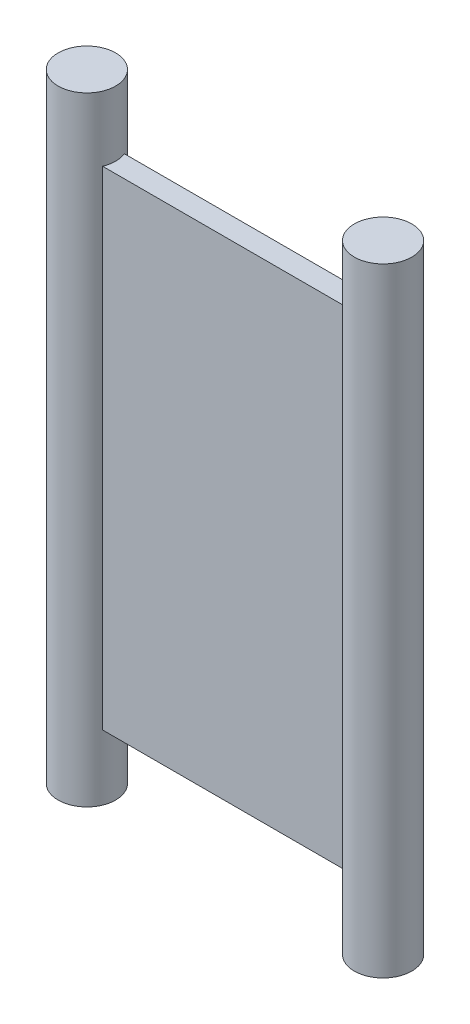
ISO-10303-21;
HEADER;
FILE_DESCRIPTION(('STEP AP214'),'2;1');
FILE_NAME('part.step','',(''),(''),'','','');
FILE_SCHEMA(('AUTOMOTIVE_DESIGN { 1 0 10303 214 1 1 1 1 }'));
ENDSEC;
DATA;
#1=APPLICATION_CONTEXT('core data for automotive mechanical design processes');
#2=APPLICATION_PROTOCOL_DEFINITION('international standard','automotive_design',2000,#1);
#3=PRODUCT_CONTEXT('',#1,'mechanical');
#4=PRODUCT('Part','Part','',(#3));
#5=PRODUCT_RELATED_PRODUCT_CATEGORY('part','',(#4));
#6=PRODUCT_DEFINITION_FORMATION('','',#4);
#7=PRODUCT_DEFINITION_CONTEXT('part definition',#1,'design');
#8=PRODUCT_DEFINITION('design','',#6,#7);
#9=PRODUCT_DEFINITION_SHAPE('','',#8);
#10=(LENGTH_UNIT() NAMED_UNIT(*) SI_UNIT(.MILLI.,.METRE.));
#11=(NAMED_UNIT(*) PLANE_ANGLE_UNIT() SI_UNIT($,.RADIAN.));
#12=(NAMED_UNIT(*) SI_UNIT($,.STERADIAN.) SOLID_ANGLE_UNIT());
#13=UNCERTAINTY_MEASURE_WITH_UNIT(LENGTH_MEASURE(1.E-05),#10,'distance_accuracy_value','');
#14=(GEOMETRIC_REPRESENTATION_CONTEXT(3) GLOBAL_UNCERTAINTY_ASSIGNED_CONTEXT((#13)) GLOBAL_UNIT_ASSIGNED_CONTEXT((#10,
#11,#12)) REPRESENTATION_CONTEXT('',''));
#15=CARTESIAN_POINT('',(0.,0.,0.));
#16=DIRECTION('',(0.,0.,1.));
#17=DIRECTION('',(1.,0.,0.));
#18=AXIS2_PLACEMENT_3D('',#15,#16,#17);
#19=CARTESIAN_POINT('',(6.826,22.5,0.499999999999999));
#20=DIRECTION('',(0.,0.,-1.));
#21=DIRECTION('',(-1.,0.,0.));
#22=AXIS2_PLACEMENT_3D('',#19,#20,#21);
#23=PLANE('',#22);
#24=DIRECTION('',(0.,-1.,0.));
#25=VECTOR('',#24,1.);
#26=CARTESIAN_POINT('',(5.5989608808192,25.5,0.499999999999999));
#27=LINE('',#26,#25);
#28=CARTESIAN_POINT('',(5.5989608808192,22.5,0.499999999999999));
#29=VERTEX_POINT('',#28);
#30=CARTESIAN_POINT('',(5.5989608808192,0.,0.499999999999999));
#31=VERTEX_POINT('',#30);
#32=EDGE_CURVE('E51',#29,#31,#27,.T.);
#33=ORIENTED_EDGE('',*,*,#32,.F.);
#34=DIRECTION('',(1.,0.,0.));
#35=VECTOR('',#34,1.);
#36=CARTESIAN_POINT('',(6.826,22.5,0.499999999999999));
#37=LINE('',#36,#35);
#38=CARTESIAN_POINT('',(-5.5989608808192,22.5,0.5));
#39=VERTEX_POINT('',#38);
#40=EDGE_CURVE('E88',#39,#29,#37,.T.);
#41=ORIENTED_EDGE('',*,*,#40,.F.);
#42=DIRECTION('',(0.,-1.,0.));
#43=VECTOR('',#42,1.);
#44=CARTESIAN_POINT('',(-5.5989608808192,25.5,0.5));
#45=LINE('',#44,#43);
#46=CARTESIAN_POINT('',(-5.5989608808192,0.,0.500000000000001));
#47=VERTEX_POINT('',#46);
#48=EDGE_CURVE('E101',#47,#39,#45,.F.);
#49=ORIENTED_EDGE('',*,*,#48,.F.);
#50=DIRECTION('',(1.,0.,0.));
#51=VECTOR('',#50,1.);
#52=CARTESIAN_POINT('',(6.826,0.,0.499999999999999));
#53=LINE('',#52,#51);
#54=EDGE_CURVE('E89',#47,#31,#53,.T.);
#55=ORIENTED_EDGE('',*,*,#54,.T.);
#56=EDGE_LOOP('',(#33,#41,#49,#55));
#57=FACE_BOUND('',#56,.T.);
#58=ADVANCED_FACE('F37',(#57),#23,.F.);
#59=CARTESIAN_POINT('',(6.826,22.5,-0.500000000000001));
#60=DIRECTION('',(0.,0.,1.));
#61=DIRECTION('',(1.,0.,0.));
#62=AXIS2_PLACEMENT_3D('',#59,#60,#61);
#63=PLANE('',#62);
#64=DIRECTION('',(0.,-1.,0.));
#65=VECTOR('',#64,1.);
#66=CARTESIAN_POINT('',(5.5989608808192,25.5,-0.500000000000001));
#67=LINE('',#66,#65);
#68=CARTESIAN_POINT('',(5.5989608808192,0.,-0.500000000000001));
#69=VERTEX_POINT('',#68);
#70=CARTESIAN_POINT('',(5.5989608808192,22.5,-0.500000000000001));
#71=VERTEX_POINT('',#70);
#72=EDGE_CURVE('E76',#69,#71,#67,.F.);
#73=ORIENTED_EDGE('',*,*,#72,.F.);
#74=DIRECTION('',(-1.,0.,0.));
#75=VECTOR('',#74,1.);
#76=CARTESIAN_POINT('',(6.826,0.,-0.500000000000001));
#77=LINE('',#76,#75);
#78=CARTESIAN_POINT('',(-5.5989608808192,0.,-0.499999999999999));
#79=VERTEX_POINT('',#78);
#80=EDGE_CURVE('E58',#69,#79,#77,.T.);
#81=ORIENTED_EDGE('',*,*,#80,.T.);
#82=DIRECTION('',(0.,-1.,0.));
#83=VECTOR('',#82,1.);
#84=CARTESIAN_POINT('',(-5.5989608808192,25.5,-0.499999999999999));
#85=LINE('',#84,#83);
#86=CARTESIAN_POINT('',(-5.5989608808192,22.5,-0.499999999999999));
#87=VERTEX_POINT('',#86);
#88=EDGE_CURVE('E103',#87,#79,#85,.T.);
#89=ORIENTED_EDGE('',*,*,#88,.F.);
#90=DIRECTION('',(-1.,0.,0.));
#91=VECTOR('',#90,1.);
#92=CARTESIAN_POINT('',(6.826,22.5,-0.500000000000001));
#93=LINE('',#92,#91);
#94=EDGE_CURVE('E83',#71,#87,#93,.T.);
#95=ORIENTED_EDGE('',*,*,#94,.F.);
#96=EDGE_LOOP('',(#73,#81,#89,#95));
#97=FACE_BOUND('',#96,.T.);
#98=ADVANCED_FACE('F82',(#97),#63,.F.);
#99=CARTESIAN_POINT('',(-6.826,25.5,0.));
#100=DIRECTION('',(0.,-1.,0.));
#101=DIRECTION('',(0.,0.,-1.));
#102=AXIS2_PLACEMENT_3D('',#99,#100,#101);
#103=CYLINDRICAL_SURFACE('',#102,1.325);
#104=CARTESIAN_POINT('',(-6.826,25.5,0.));
#105=DIRECTION('',(0.,1.,0.));
#106=DIRECTION('',(0.,0.,1.));
#107=AXIS2_PLACEMENT_3D('',#104,#105,#106);
#108=CIRCLE('',#107,1.325);
#109=CARTESIAN_POINT('',(-6.826,25.5,1.325));
#110=VERTEX_POINT('',#109);
#111=EDGE_CURVE('E105',#110,#110,#108,.T.);
#112=ORIENTED_EDGE('',*,*,#111,.F.);
#113=EDGE_LOOP('',(#112));
#114=FACE_BOUND('',#113,.T.);
#115=CARTESIAN_POINT('',(-6.826,-3.,0.));
#116=DIRECTION('',(0.,1.,0.));
#117=DIRECTION('',(0.,0.,1.));
#118=AXIS2_PLACEMENT_3D('',#115,#116,#117);
#119=CIRCLE('',#118,1.325);
#120=CARTESIAN_POINT('',(-6.826,-3.,1.325));
#121=VERTEX_POINT('',#120);
#122=EDGE_CURVE('E106',#121,#121,#119,.T.);
#123=ORIENTED_EDGE('',*,*,#122,.T.);
#124=EDGE_LOOP('',(#123));
#125=FACE_BOUND('',#124,.T.);
#126=ORIENTED_EDGE('',*,*,#48,.T.);
#127=CARTESIAN_POINT('',(-6.826,22.5,0.));
#128=DIRECTION('',(0.,-1.,0.));
#129=DIRECTION('',(0.,0.,-1.));
#130=AXIS2_PLACEMENT_3D('',#127,#128,#129);
#131=CIRCLE('',#130,1.325);
#132=EDGE_CURVE('E93',#39,#87,#131,.F.);
#133=ORIENTED_EDGE('',*,*,#132,.T.);
#134=ORIENTED_EDGE('',*,*,#88,.T.);
#135=CARTESIAN_POINT('',(-6.826,0.,0.));
#136=DIRECTION('',(0.,-1.,0.));
#137=DIRECTION('',(0.,0.,-1.));
#138=AXIS2_PLACEMENT_3D('',#135,#136,#137);
#139=CIRCLE('',#138,1.325);
#140=EDGE_CURVE('E44',#47,#79,#139,.F.);
#141=ORIENTED_EDGE('',*,*,#140,.F.);
#142=EDGE_LOOP('',(#126,#133,#134,#141));
#143=FACE_BOUND('',#142,.T.);
#144=ADVANCED_FACE('F136',(#114,#125,#143),#103,.T.);
#145=CARTESIAN_POINT('',(-6.826,25.5,0.));
#146=DIRECTION('',(0.,1.,0.));
#147=DIRECTION('',(0.,0.,1.));
#148=AXIS2_PLACEMENT_3D('',#145,#146,#147);
#149=PLANE('',#148);
#150=ORIENTED_EDGE('',*,*,#111,.T.);
#151=EDGE_LOOP('',(#150));
#152=FACE_BOUND('',#151,.T.);
#153=ADVANCED_FACE('F142',(#152),#149,.T.);
#154=CARTESIAN_POINT('',(-6.826,-3.,0.));
#155=DIRECTION('',(0.,1.,0.));
#156=DIRECTION('',(0.,0.,1.));
#157=AXIS2_PLACEMENT_3D('',#154,#155,#156);
#158=PLANE('',#157);
#159=ORIENTED_EDGE('',*,*,#122,.F.);
#160=EDGE_LOOP('',(#159));
#161=FACE_BOUND('',#160,.T.);
#162=ADVANCED_FACE('F148',(#161),#158,.F.);
#163=CARTESIAN_POINT('',(0.,22.5,0.));
#164=DIRECTION('',(0.,-1.,0.));
#165=DIRECTION('',(0.,0.,-1.));
#166=AXIS2_PLACEMENT_3D('',#163,#164,#165);
#167=PLANE('',#166);
#168=CARTESIAN_POINT('',(6.826,22.5,0.));
#169=DIRECTION('',(0.,-1.,0.));
#170=DIRECTION('',(0.,0.,-1.));
#171=AXIS2_PLACEMENT_3D('',#168,#169,#170);
#172=CIRCLE('',#171,1.325);
#173=EDGE_CURVE('E109',#71,#29,#172,.F.);
#174=ORIENTED_EDGE('',*,*,#173,.F.);
#175=ORIENTED_EDGE('',*,*,#94,.T.);
#176=ORIENTED_EDGE('',*,*,#132,.F.);
#177=ORIENTED_EDGE('',*,*,#40,.T.);
#178=EDGE_LOOP('',(#174,#175,#176,#177));
#179=FACE_BOUND('',#178,.T.);
#180=ADVANCED_FACE('F139',(#179),#167,.F.);
#181=CARTESIAN_POINT('',(0.,0.,0.));
#182=DIRECTION('',(0.,-1.,0.));
#183=DIRECTION('',(0.,0.,-1.));
#184=AXIS2_PLACEMENT_3D('',#181,#182,#183);
#185=PLANE('',#184);
#186=ORIENTED_EDGE('',*,*,#80,.F.);
#187=CARTESIAN_POINT('',(6.826,0.,0.));
#188=DIRECTION('',(0.,-1.,0.));
#189=DIRECTION('',(0.,0.,-1.));
#190=AXIS2_PLACEMENT_3D('',#187,#188,#189);
#191=CIRCLE('',#190,1.325);
#192=EDGE_CURVE('E11',#69,#31,#191,.F.);
#193=ORIENTED_EDGE('',*,*,#192,.T.);
#194=ORIENTED_EDGE('',*,*,#54,.F.);
#195=ORIENTED_EDGE('',*,*,#140,.T.);
#196=EDGE_LOOP('',(#186,#193,#194,#195));
#197=FACE_BOUND('',#196,.T.);
#198=ADVANCED_FACE('F87',(#197),#185,.T.);
#199=CARTESIAN_POINT('',(6.826,25.5,0.));
#200=DIRECTION('',(0.,-1.,0.));
#201=DIRECTION('',(0.,0.,-1.));
#202=AXIS2_PLACEMENT_3D('',#199,#200,#201);
#203=CYLINDRICAL_SURFACE('',#202,1.325);
#204=CARTESIAN_POINT('',(6.826,25.5,0.));
#205=DIRECTION('',(0.,1.,0.));
#206=DIRECTION('',(0.,0.,1.));
#207=AXIS2_PLACEMENT_3D('',#204,#205,#206);
#208=CIRCLE('',#207,1.325);
#209=CARTESIAN_POINT('',(6.826,25.5,1.325));
#210=VERTEX_POINT('',#209);
#211=EDGE_CURVE('E114',#210,#210,#208,.T.);
#212=ORIENTED_EDGE('',*,*,#211,.F.);
#213=EDGE_LOOP('',(#212));
#214=FACE_BOUND('',#213,.T.);
#215=CARTESIAN_POINT('',(6.826,-3.,0.));
#216=DIRECTION('',(0.,1.,0.));
#217=DIRECTION('',(0.,0.,1.));
#218=AXIS2_PLACEMENT_3D('',#215,#216,#217);
#219=CIRCLE('',#218,1.325);
#220=CARTESIAN_POINT('',(6.826,-3.,1.325));
#221=VERTEX_POINT('',#220);
#222=EDGE_CURVE('E84',#221,#221,#219,.T.);
#223=ORIENTED_EDGE('',*,*,#222,.T.);
#224=EDGE_LOOP('',(#223));
#225=FACE_BOUND('',#224,.T.);
#226=ORIENTED_EDGE('',*,*,#72,.T.);
#227=ORIENTED_EDGE('',*,*,#173,.T.);
#228=ORIENTED_EDGE('',*,*,#32,.T.);
#229=ORIENTED_EDGE('',*,*,#192,.F.);
#230=EDGE_LOOP('',(#226,#227,#228,#229));
#231=FACE_BOUND('',#230,.T.);
#232=ADVANCED_FACE('F75',(#214,#225,#231),#203,.T.);
#233=CARTESIAN_POINT('',(6.826,25.5,0.));
#234=DIRECTION('',(0.,1.,0.));
#235=DIRECTION('',(0.,0.,1.));
#236=AXIS2_PLACEMENT_3D('',#233,#234,#235);
#237=PLANE('',#236);
#238=ORIENTED_EDGE('',*,*,#211,.T.);
#239=EDGE_LOOP('',(#238));
#240=FACE_BOUND('',#239,.T.);
#241=ADVANCED_FACE('F123',(#240),#237,.T.);
#242=CARTESIAN_POINT('',(6.826,-3.,0.));
#243=DIRECTION('',(0.,1.,0.));
#244=DIRECTION('',(0.,0.,1.));
#245=AXIS2_PLACEMENT_3D('',#242,#243,#244);
#246=PLANE('',#245);
#247=ORIENTED_EDGE('',*,*,#222,.F.);
#248=EDGE_LOOP('',(#247));
#249=FACE_BOUND('',#248,.T.);
#250=ADVANCED_FACE('F121',(#249),#246,.F.);
#251=CLOSED_SHELL('',(#58,#98,#144,#153,#162,#180,#198,#232,#241,#250));
#252=MANIFOLD_SOLID_BREP('B2',#251);
#253=ADVANCED_BREP_SHAPE_REPRESENTATION('',(#18,#252),#14);
#254=SHAPE_DEFINITION_REPRESENTATION(#9,#253);
ENDSEC;
END-ISO-10303-21;
